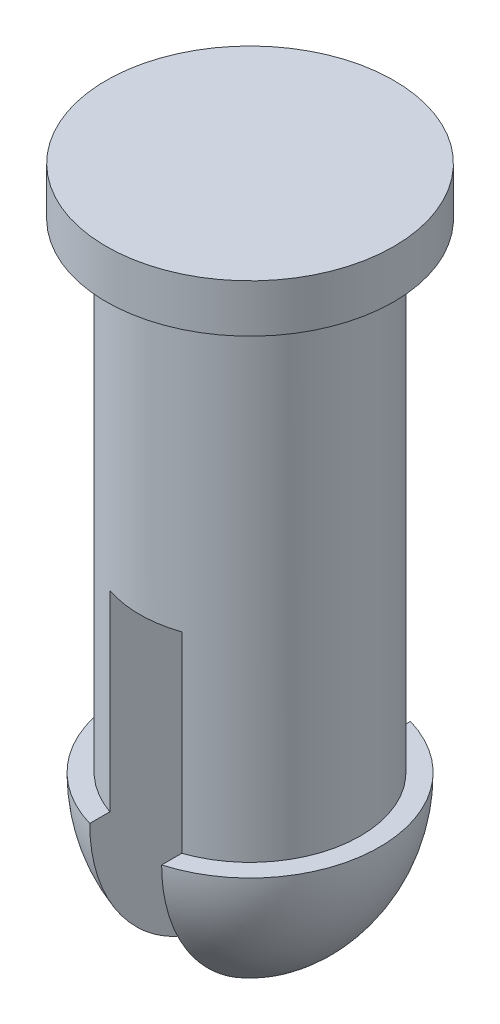
ISO-10303-21;
HEADER;
FILE_DESCRIPTION(('STEP AP214'),'2;1');
FILE_NAME('part.step','',(''),(''),'','','');
FILE_SCHEMA(('AUTOMOTIVE_DESIGN { 1 0 10303 214 1 1 1 1 }'));
ENDSEC;
DATA;
#1=APPLICATION_CONTEXT('core data for automotive mechanical design processes');
#2=APPLICATION_PROTOCOL_DEFINITION('international standard','automotive_design',2000,#1);
#3=PRODUCT_CONTEXT('',#1,'mechanical');
#4=PRODUCT('Part','Part','',(#3));
#5=PRODUCT_RELATED_PRODUCT_CATEGORY('part','',(#4));
#6=PRODUCT_DEFINITION_FORMATION('','',#4);
#7=PRODUCT_DEFINITION_CONTEXT('part definition',#1,'design');
#8=PRODUCT_DEFINITION('design','',#6,#7);
#9=PRODUCT_DEFINITION_SHAPE('','',#8);
#10=(LENGTH_UNIT() NAMED_UNIT(*) SI_UNIT(.MILLI.,.METRE.));
#11=(NAMED_UNIT(*) PLANE_ANGLE_UNIT() SI_UNIT($,.RADIAN.));
#12=(NAMED_UNIT(*) SI_UNIT($,.STERADIAN.) SOLID_ANGLE_UNIT());
#13=UNCERTAINTY_MEASURE_WITH_UNIT(LENGTH_MEASURE(1.E-05),#10,'distance_accuracy_value','');
#14=(GEOMETRIC_REPRESENTATION_CONTEXT(3) GLOBAL_UNCERTAINTY_ASSIGNED_CONTEXT((#13)) GLOBAL_UNIT_ASSIGNED_CONTEXT((#10,
#11,#12)) REPRESENTATION_CONTEXT('',''));
#15=CARTESIAN_POINT('',(0.,0.,0.));
#16=DIRECTION('',(0.,0.,1.));
#17=DIRECTION('',(1.,0.,0.));
#18=AXIS2_PLACEMENT_3D('',#15,#16,#17);
#19=CARTESIAN_POINT('',(0.,0.254,0.));
#20=DIRECTION('',(0.,-1.,0.));
#21=DIRECTION('',(1.,0.,0.));
#22=AXIS2_PLACEMENT_3D('',#19,#20,#21);
#23=DEGENERATE_TOROIDAL_SURFACE('',#22,0.100424074074073,0.443324074074074,.F.);
#24=CARTESIAN_POINT('',(-0.09525,-0.14380383531194,0.));
#25=CARTESIAN_POINT('',(-0.09525,-0.143798708598324,-0.0116978865939817));
#26=CARTESIAN_POINT('',(-0.09525,-0.142715538211138,-0.0234088814016298));
#27=CARTESIAN_POINT('',(-0.09525,-0.138657207219164,-0.0465179519451306));
#28=CARTESIAN_POINT('',(-0.09525,-0.135673977682257,-0.0579144758231862));
#29=CARTESIAN_POINT('',(-0.09525,-0.12632829282076,-0.0861002756112994));
#30=CARTESIAN_POINT('',(-0.09525,-0.11901364004664,-0.102569887425098));
#31=CARTESIAN_POINT('',(-0.09525,-0.101956977386856,-0.134180103254347));
#32=CARTESIAN_POINT('',(-0.09525,-0.0922120534239419,-0.149319082052771));
#33=CARTESIAN_POINT('',(-0.09525,-0.0702582579208381,-0.178715200741944));
#34=CARTESIAN_POINT('',(-0.09525,-0.057961798385589,-0.192906889548112));
#35=CARTESIAN_POINT('',(-0.09525,-0.0315463794091867,-0.21944697342977));
#36=CARTESIAN_POINT('',(-0.09525,-0.0174286233447382,-0.23179657410469));
#37=CARTESIAN_POINT('',(-0.09525,0.015476755915726,-0.256870258977447));
#38=CARTESIAN_POINT('',(-0.09525,0.0346223542071199,-0.269127970422762));
#39=CARTESIAN_POINT('',(-0.09525,0.0746448702039047,-0.290416918236679));
#40=CARTESIAN_POINT('',(-0.09525,0.0955233241799726,-0.299445253117677));
#41=CARTESIAN_POINT('',(-0.09525,0.139377798701819,-0.314366568068082));
#42=CARTESIAN_POINT('',(-0.09525,0.162405368767697,-0.320108567852826));
#43=CARTESIAN_POINT('',(-0.09525,0.209090106346814,-0.327690915938621));
#44=CARTESIAN_POINT('',(-0.09525,0.232747219687902,-0.329531598855477));
#45=CARTESIAN_POINT('',(-0.09525,0.280306903484965,-0.329264033719875));
#46=CARTESIAN_POINT('',(-0.09525,0.304209238168853,-0.327111084682118));
#47=CARTESIAN_POINT('',(-0.09525,0.351315212960913,-0.318824283635956));
#48=CARTESIAN_POINT('',(-0.09525,0.374518812965187,-0.312690203584374));
#49=CARTESIAN_POINT('',(-0.09525,0.419565307751267,-0.296601548392065));
#50=CARTESIAN_POINT('',(-0.09525,0.441408042354345,-0.286646524496316));
#51=CARTESIAN_POINT('',(-0.09525,0.483094582715537,-0.263171080041853));
#52=CARTESIAN_POINT('',(-0.09525,0.502938092242373,-0.249650132179939));
#53=CARTESIAN_POINT('',(-0.09525,0.53980057194147,-0.219551779175753));
#54=CARTESIAN_POINT('',(-0.09525,0.556847253785236,-0.203008293323007));
#55=CARTESIAN_POINT('',(-0.09525,0.587764056498323,-0.167146891067861));
#56=CARTESIAN_POINT('',(-0.09525,0.60163515097761,-0.147829827985736));
#57=CARTESIAN_POINT('',(-0.09525,0.620704370609078,-0.114835283701304));
#58=CARTESIAN_POINT('',(-0.09525,0.627177472814807,-0.101886285048612));
#59=CARTESIAN_POINT('',(-0.09525,0.63823032104283,-0.0752144754912631));
#60=CARTESIAN_POINT('',(-0.09525,0.642815278975796,-0.0614939151343913));
#61=CARTESIAN_POINT('',(-0.09525,0.648759274674796,-0.0361940286838822));
#62=CARTESIAN_POINT('',(-0.09525,0.650576517058823,-0.0247268282736564));
#63=CARTESIAN_POINT('',(-0.09525,0.652133783254577,-0.00166234313923318));
#64=CARTESIAN_POINT('',(-0.09525,0.651877892164309,0.00993464081327145));
#65=CARTESIAN_POINT('',(-0.09525,0.649378700028875,0.0328429115374028));
#66=CARTESIAN_POINT('',(-0.09525,0.647144335046938,0.0441552479711653));
#67=CARTESIAN_POINT('',(-0.09525,0.641127144538548,0.0663826071048562));
#68=CARTESIAN_POINT('',(-0.09525,0.637338731193054,0.0772960396366597));
#69=CARTESIAN_POINT('',(-0.09525,0.625525330737952,0.105986515104124));
#70=CARTESIAN_POINT('',(-0.09525,0.616380801067651,0.123303318103477));
#71=CARTESIAN_POINT('',(-0.09525,0.595505520051646,0.156271040357609));
#72=CARTESIAN_POINT('',(-0.09525,0.583773102885923,0.171920876922021));
#73=CARTESIAN_POINT('',(-0.09525,0.557768760477826,0.201774418592652));
#74=CARTESIAN_POINT('',(-0.09525,0.543431995199821,0.215921670632783));
#75=CARTESIAN_POINT('',(-0.09525,0.512863814559463,0.241973854693591));
#76=CARTESIAN_POINT('',(-0.09525,0.496632872797671,0.253879345284096));
#77=CARTESIAN_POINT('',(-0.09525,0.46009498350072,0.276838628633972));
#78=CARTESIAN_POINT('',(-0.09525,0.439540983434918,0.287501614793902));
#79=CARTESIAN_POINT('',(-0.09525,0.396964577453154,0.305341650380823));
#80=CARTESIAN_POINT('',(-0.09525,0.374941389024291,0.312516825011983));
#81=CARTESIAN_POINT('',(-0.09525,0.329361619975479,0.323357104557578));
#82=CARTESIAN_POINT('',(-0.09525,0.305779014485842,0.326913153314081));
#83=CARTESIAN_POINT('',(-0.09525,0.258350620993315,0.330045936990706));
#84=CARTESIAN_POINT('',(-0.09525,0.234504815432745,0.329622404816861));
#85=CARTESIAN_POINT('',(-0.09525,0.187044495039853,0.324789330992645));
#86=CARTESIAN_POINT('',(-0.09525,0.163432917398416,0.320350865209196));
#87=CARTESIAN_POINT('',(-0.09525,0.117299024014177,0.307565996622778));
#88=CARTESIAN_POINT('',(-0.09525,0.0947763977189524,0.299220715323889));
#89=CARTESIAN_POINT('',(-0.09525,0.0515220300310496,0.278868270454153));
#90=CARTESIAN_POINT('',(-0.09525,0.0307857910164995,0.266870669966883));
#91=CARTESIAN_POINT('',(-0.09525,-0.00836210083103733,0.239495531622993));
#92=CARTESIAN_POINT('',(-0.09525,-0.0267713123633263,0.224114489762165));
#93=CARTESIAN_POINT('',(-0.09525,-0.0603344558824616,0.190643215186327));
#94=CARTESIAN_POINT('',(-0.09525,-0.0755365792341319,0.172601254813188));
#95=CARTESIAN_POINT('',(-0.09525,-0.102393694991928,0.134012956565368));
#96=CARTESIAN_POINT('',(-0.09525,-0.114053440093834,0.113470026492505));
#97=CARTESIAN_POINT('',(-0.09525,-0.128492885752878,0.0797585630506732));
#98=CARTESIAN_POINT('',(-0.09525,-0.132926025386191,0.0672944308752063));
#99=CARTESIAN_POINT('',(-0.09525,-0.13972331098491,0.0418403142864246));
#100=CARTESIAN_POINT('',(-0.09525,-0.142098727806521,0.0288536074685724));
#101=CARTESIAN_POINT('',(-0.09525,-0.143590110948546,0.0105262853654323));
#102=CARTESIAN_POINT('',(-0.09525,-0.143806142517634,0.00526447010171672));
#103=CARTESIAN_POINT('',(-0.09525,-0.14380383531194,0.));
#104=B_SPLINE_CURVE_WITH_KNOTS('',3,(#24,#25,#26,#27,#28,#29,#30,#31,#32,#33,#34,#35,#36,#37,
#38,#39,#40,#41,#42,#43,#44,#45,#46,#47,#48,#49,#50,#51,#52,#53,#54,#55,#56,#57,#58,#59,#60,#61,
#62,#63,#64,#65,#66,#67,#68,#69,#70,#71,#72,#73,#74,#75,#76,#77,#78,#79,#80,#81,#82,#83,#84,#85,
#86,#87,#88,#89,#90,#91,#92,#93,#94,#95,#96,#97,#98,#99,#100,#101,#102,#103),.UNSPECIFIED.,.T.,
.F.,(4,2,2,2,2,2,2,2,2,2,2,2,2,2,2,2,2,2,2,2,2,2,2,2,2,2,2,2,2,2,2,2,2,2,2,2,2,2,2,4),(0.,
0.0350771900369046,0.0703043438095146,0.124077559639555,0.177915566236281,0.234057250899011,
0.290162029512963,0.358053437946411,0.426005692239297,0.49687062542198,0.567729480275961,
0.639386252836186,0.711047130330509,0.782716426693327,0.854396326944428,0.925316385332746,
0.996214670985821,1.03953954585877,1.08274401473299,1.11741781755031,1.15202331247434,
1.18647329943672,1.22104825777108,1.27948097447399,1.33795141458389,1.39815099764076,
1.45833556112645,1.52748201207388,1.59666559017611,1.66787715004796,1.7390934893964,
1.81082700301668,1.88253993717953,1.95406669301936,2.02566787604014,2.09610138125841,
2.16643996647697,2.20601435037277,2.2453705757496,2.26115657407655),.UNSPECIFIED.);
#105=CARTESIAN_POINT('',(-0.09525,0.253999999999976,0.329405293673312));
#106=VERTEX_POINT('',#105);
#107=CARTESIAN_POINT('',(-0.09525,0.253999999999976,-0.329405293673312));
#108=VERTEX_POINT('',#107);
#109=EDGE_CURVE('E153',#106,#108,#104,.T.);
#110=ORIENTED_EDGE('',*,*,#109,.F.);
#111=CARTESIAN_POINT('',(0.,0.253999999999976,0.));
#112=DIRECTION('',(0.,-1.,0.));
#113=DIRECTION('',(1.,0.,0.));
#114=AXIS2_PLACEMENT_3D('',#111,#112,#113);
#115=CIRCLE('',#114,0.342900000000001);
#116=EDGE_CURVE('E155',#106,#108,#115,.T.);
#117=ORIENTED_EDGE('',*,*,#116,.T.);
#118=EDGE_LOOP('',(#110,#117));
#119=FACE_BOUND('',#118,.T.);
#120=ADVANCED_FACE('F36',(#119),#23,.F.);
#121=CARTESIAN_POINT('',(0.2921,0.254,0.));
#122=DIRECTION('',(0.,1.,0.));
#123=DIRECTION('',(-1.,0.,0.));
#124=AXIS2_PLACEMENT_3D('',#121,#122,#123);
#125=PLANE('',#124);
#126=DIRECTION('',(0.,0.,1.));
#127=VECTOR('',#126,1.);
#128=CARTESIAN_POINT('',(-0.09525,0.253999999999998,0.));
#129=LINE('',#128,#127);
#130=CARTESIAN_POINT('',(-0.09525,0.253999999999976,-0.276133749295519));
#131=VERTEX_POINT('',#130);
#132=EDGE_CURVE('E60',#108,#131,#129,.T.);
#133=ORIENTED_EDGE('',*,*,#132,.F.);
#134=ORIENTED_EDGE('',*,*,#116,.F.);
#135=CARTESIAN_POINT('',(-0.09525,0.253999999999976,0.276133749295519));
#136=VERTEX_POINT('',#135);
#137=EDGE_CURVE('E161',#136,#106,#129,.T.);
#138=ORIENTED_EDGE('',*,*,#137,.F.);
#139=CARTESIAN_POINT('',(0.,0.253999999999976,0.));
#140=DIRECTION('',(0.,-1.,0.));
#141=DIRECTION('',(1.,0.,0.));
#142=AXIS2_PLACEMENT_3D('',#139,#140,#141);
#143=CIRCLE('',#142,0.292100000000001);
#144=EDGE_CURVE('E165',#136,#131,#143,.T.);
#145=ORIENTED_EDGE('',*,*,#144,.T.);
#146=EDGE_LOOP('',(#133,#134,#138,#145));
#147=FACE_BOUND('',#146,.T.);
#148=ADVANCED_FACE('F127',(#147),#125,.T.);
#149=CARTESIAN_POINT('',(0.09525,-0.14380383531194,0.));
#150=CARTESIAN_POINT('',(0.09525,-0.143798708598324,0.0116978865939816));
#151=CARTESIAN_POINT('',(0.09525,-0.142715538211138,0.0234088814016297));
#152=CARTESIAN_POINT('',(0.09525,-0.138657207219164,0.0465179519451303));
#153=CARTESIAN_POINT('',(0.09525,-0.135673977682256,0.0579144758231858));
#154=CARTESIAN_POINT('',(0.09525,-0.12632829282076,0.0861002756112989));
#155=CARTESIAN_POINT('',(0.09525,-0.11901364004664,0.102569887425098));
#156=CARTESIAN_POINT('',(0.09525,-0.101956977386856,0.134180103254346));
#157=CARTESIAN_POINT('',(0.09525,-0.0922120534239419,0.149319082052771));
#158=CARTESIAN_POINT('',(0.09525,-0.0702582579208381,0.178715200741943));
#159=CARTESIAN_POINT('',(0.09525,-0.057961798385589,0.192906889548112));
#160=CARTESIAN_POINT('',(0.09525,-0.0315463794091867,0.21944697342977));
#161=CARTESIAN_POINT('',(0.09525,-0.0174286233447383,0.231796574104689));
#162=CARTESIAN_POINT('',(0.09525,0.015476755915726,0.256870258977447));
#163=CARTESIAN_POINT('',(0.09525,0.0346223542071198,0.269127970422761));
#164=CARTESIAN_POINT('',(0.09525,0.0746448702039045,0.290416918236678));
#165=CARTESIAN_POINT('',(0.0952499999999999,0.0955233241799724,0.299445253117676));
#166=CARTESIAN_POINT('',(0.0952499999999999,0.139377798701818,0.314366568068081));
#167=CARTESIAN_POINT('',(0.0952499999999999,0.162405368767696,0.320108567852825));
#168=CARTESIAN_POINT('',(0.0952499999999999,0.209090106346813,0.327690915938621));
#169=CARTESIAN_POINT('',(0.0952499999999999,0.232747219687902,0.329531598855476));
#170=CARTESIAN_POINT('',(0.0952499999999999,0.280306903484964,0.329264033719875));
#171=CARTESIAN_POINT('',(0.0952499999999999,0.304209238168852,0.327111084682118));
#172=CARTESIAN_POINT('',(0.0952499999999999,0.351315212960913,0.318824283635955));
#173=CARTESIAN_POINT('',(0.0952499999999999,0.374518812965187,0.312690203584374));
#174=CARTESIAN_POINT('',(0.0952499999999998,0.419565307751267,0.296601548392065));
#175=CARTESIAN_POINT('',(0.0952499999999998,0.441408042354344,0.286646524496315));
#176=CARTESIAN_POINT('',(0.0952499999999998,0.483094582715537,0.263171080041853));
#177=CARTESIAN_POINT('',(0.0952499999999998,0.502938092242372,0.249650132179939));
#178=CARTESIAN_POINT('',(0.0952499999999998,0.539800571941469,0.219551779175752));
#179=CARTESIAN_POINT('',(0.0952499999999998,0.556847253785235,0.203008293323007));
#180=CARTESIAN_POINT('',(0.0952499999999998,0.587764056498322,0.167146891067861));
#181=CARTESIAN_POINT('',(0.0952499999999998,0.601635150977609,0.147829827985736));
#182=CARTESIAN_POINT('',(0.0952499999999998,0.620704370609077,0.114835283701304));
#183=CARTESIAN_POINT('',(0.0952499999999998,0.627177472814806,0.101886285048612));
#184=CARTESIAN_POINT('',(0.0952499999999998,0.638230321042829,0.0752144754912629));
#185=CARTESIAN_POINT('',(0.0952499999999998,0.642815278975795,0.0614939151343909));
#186=CARTESIAN_POINT('',(0.0952499999999998,0.648759274674795,0.0361940286838815));
#187=CARTESIAN_POINT('',(0.0952499999999998,0.650576517058822,0.0247268282736555));
#188=CARTESIAN_POINT('',(0.0952499999999998,0.652133783254575,0.0016623431392319));
#189=CARTESIAN_POINT('',(0.0952499999999998,0.651877892164307,-0.00993464081327287));
#190=CARTESIAN_POINT('',(0.0952499999999998,0.649378700028873,-0.0328429115374046));
#191=CARTESIAN_POINT('',(0.0952499999999998,0.647144335046936,-0.0441552479711672));
#192=CARTESIAN_POINT('',(0.0952499999999998,0.641127144538546,-0.0663826071048584));
#193=CARTESIAN_POINT('',(0.0952499999999998,0.637338731193052,-0.077296039636662));
#194=CARTESIAN_POINT('',(0.0952499999999998,0.62552533073795,-0.105986515104127));
#195=CARTESIAN_POINT('',(0.0952499999999998,0.616380801067649,-0.12330331810348));
#196=CARTESIAN_POINT('',(0.0952499999999998,0.595505520051644,-0.156271040357612));
#197=CARTESIAN_POINT('',(0.0952499999999998,0.58377310288592,-0.171920876922023));
#198=CARTESIAN_POINT('',(0.0952499999999998,0.557768760477823,-0.201774418592654));
#199=CARTESIAN_POINT('',(0.0952499999999998,0.543431995199818,-0.215921670632785));
#200=CARTESIAN_POINT('',(0.0952499999999998,0.512863814559459,-0.241973854693592));
#201=CARTESIAN_POINT('',(0.0952499999999998,0.496632872797668,-0.253879345284097));
#202=CARTESIAN_POINT('',(0.0952499999999998,0.460094983500717,-0.276838628633973));
#203=CARTESIAN_POINT('',(0.0952499999999999,0.439540983434915,-0.287501614793903));
#204=CARTESIAN_POINT('',(0.0952499999999999,0.396964577453151,-0.305341650380823));
#205=CARTESIAN_POINT('',(0.0952499999999999,0.374941389024288,-0.312516825011983));
#206=CARTESIAN_POINT('',(0.0952499999999999,0.329361619975476,-0.323357104557578));
#207=CARTESIAN_POINT('',(0.0952499999999999,0.305779014485839,-0.326913153314081));
#208=CARTESIAN_POINT('',(0.0952499999999999,0.258350620993312,-0.330045936990706));
#209=CARTESIAN_POINT('',(0.0952499999999999,0.234504815432742,-0.32962240481686));
#210=CARTESIAN_POINT('',(0.0952499999999999,0.18704449503985,-0.324789330992645));
#211=CARTESIAN_POINT('',(0.0952499999999999,0.163432917398414,-0.320350865209195));
#212=CARTESIAN_POINT('',(0.09525,0.117299024014174,-0.307565996622777));
#213=CARTESIAN_POINT('',(0.09525,0.09477639771895,-0.299220715323888));
#214=CARTESIAN_POINT('',(0.09525,0.0515220300310475,-0.278868270454151));
#215=CARTESIAN_POINT('',(0.09525,0.0307857910164975,-0.266870669966881));
#216=CARTESIAN_POINT('',(0.09525,-0.00836210083103915,-0.239495531622991));
#217=CARTESIAN_POINT('',(0.09525,-0.0267713123633281,-0.224114489762163));
#218=CARTESIAN_POINT('',(0.09525,-0.0603344558824631,-0.190643215186325));
#219=CARTESIAN_POINT('',(0.09525,-0.0755365792341332,-0.172601254813185));
#220=CARTESIAN_POINT('',(0.09525,-0.10239369499193,-0.134012956565366));
#221=CARTESIAN_POINT('',(0.09525,-0.114053440093835,-0.113470026492503));
#222=CARTESIAN_POINT('',(0.09525,-0.128492885752879,-0.0797585630506708));
#223=CARTESIAN_POINT('',(0.09525,-0.132926025386191,-0.067294430875204));
#224=CARTESIAN_POINT('',(0.09525,-0.139723310984911,-0.0418403142864225));
#225=CARTESIAN_POINT('',(0.09525,-0.142098727806521,-0.0288536074685705));
#226=CARTESIAN_POINT('',(0.09525,-0.143590110948546,-0.0105262853654311));
#227=CARTESIAN_POINT('',(0.09525,-0.143806142517634,-0.00526447010171612));
#228=CARTESIAN_POINT('',(0.09525,-0.14380383531194,0.));
#229=B_SPLINE_CURVE_WITH_KNOTS('',3,(#149,#150,#151,#152,#153,#154,#155,#156,#157,#158,#159,
#160,#161,#162,#163,#164,#165,#166,#167,#168,#169,#170,#171,#172,#173,#174,#175,#176,#177,#178,
#179,#180,#181,#182,#183,#184,#185,#186,#187,#188,#189,#190,#191,#192,#193,#194,#195,#196,#197,
#198,#199,#200,#201,#202,#203,#204,#205,#206,#207,#208,#209,#210,#211,#212,#213,#214,#215,#216,
#217,#218,#219,#220,#221,#222,#223,#224,#225,#226,#227,#228),.UNSPECIFIED.,.T.,.F.,(4,2,2,2,2,2,
2,2,2,2,2,2,2,2,2,2,2,2,2,2,2,2,2,2,2,2,2,2,2,2,2,2,2,2,2,2,2,2,2,4),(0.,0.0350771900369044,
0.0703043438095141,0.124077559639555,0.177915566236281,0.23405725089901,0.290162029512963,
0.35805343794641,0.426005692239296,0.496870625421979,0.56772948027596,0.639386252836185,
0.711047130330507,0.782716426693326,0.854396326944426,0.925316385332745,0.996214670985819,
1.03953954585877,1.08274401473299,1.11741781755031,1.15202331247434,1.18647329943672,
1.22104825777108,1.27948097447399,1.33795141458389,1.39815099764076,1.45833556112645,
1.52748201207388,1.59666559017611,1.66787715004796,1.7390934893964,1.81082700301668,
1.88253993717953,1.95406669301936,2.02566787604014,2.0961013812584,2.16643996647696,
2.20601435037277,2.24537057574959,2.26115657407655),.UNSPECIFIED.);
#230=CARTESIAN_POINT('',(0.0952499999999999,0.253999999999977,-0.329405293673312));
#231=VERTEX_POINT('',#230);
#232=CARTESIAN_POINT('',(0.0952499999999999,0.253999999999977,0.329405293673312));
#233=VERTEX_POINT('',#232);
#234=EDGE_CURVE('E107',#231,#233,#229,.T.);
#235=ORIENTED_EDGE('',*,*,#234,.F.);
#236=EDGE_CURVE('E163',#231,#233,#115,.T.);
#237=ORIENTED_EDGE('',*,*,#236,.T.);
#238=EDGE_LOOP('',(#235,#237));
#239=FACE_BOUND('',#238,.T.);
#240=ADVANCED_FACE('F38',(#239),#23,.F.);
#241=CARTESIAN_POINT('',(0.,1.651,0.));
#242=DIRECTION('',(0.,1.,0.));
#243=DIRECTION('',(-1.,0.,0.));
#244=AXIS2_PLACEMENT_3D('',#241,#242,#243);
#245=PLANE('',#244);
#246=CARTESIAN_POINT('',(0.,1.65100000000007,0.));
#247=DIRECTION('',(0.,-1.,0.));
#248=DIRECTION('',(1.,0.,0.));
#249=AXIS2_PLACEMENT_3D('',#246,#247,#248);
#250=CIRCLE('',#249,0.381000000000006);
#251=CARTESIAN_POINT('',(0.381,1.65100000000007,0.));
#252=VERTEX_POINT('',#251);
#253=EDGE_CURVE('E176',#252,#252,#250,.T.);
#254=ORIENTED_EDGE('',*,*,#253,.F.);
#255=EDGE_LOOP('',(#254));
#256=FACE_BOUND('',#255,.T.);
#257=ADVANCED_FACE('F136',(#256),#245,.T.);
#258=CARTESIAN_POINT('',(3.43024899888577E-12,-1000.,0.));
#259=DIRECTION('',(0.,-1.,0.));
#260=DIRECTION('',(1.,0.,0.));
#261=AXIS2_PLACEMENT_3D('',#258,#259,#260);
#262=CYLINDRICAL_SURFACE('',#261,0.381000000000005);
#263=ORIENTED_EDGE('',*,*,#253,.T.);
#264=EDGE_LOOP('',(#263));
#265=FACE_BOUND('',#264,.T.);
#266=CARTESIAN_POINT('',(0.,1.52400000000008,0.));
#267=DIRECTION('',(0.,-1.,0.));
#268=DIRECTION('',(1.,0.,0.));
#269=AXIS2_PLACEMENT_3D('',#266,#267,#268);
#270=CIRCLE('',#269,0.381000000000005);
#271=CARTESIAN_POINT('',(0.381,1.52400000000008,0.));
#272=VERTEX_POINT('',#271);
#273=EDGE_CURVE('E173',#272,#272,#270,.T.);
#274=ORIENTED_EDGE('',*,*,#273,.F.);
#275=EDGE_LOOP('',(#274));
#276=FACE_BOUND('',#275,.T.);
#277=ADVANCED_FACE('F133',(#265,#276),#262,.T.);
#278=CARTESIAN_POINT('',(0.381,1.524,0.));
#279=DIRECTION('',(0.,-1.,0.));
#280=DIRECTION('',(1.,0.,0.));
#281=AXIS2_PLACEMENT_3D('',#278,#279,#280);
#282=PLANE('',#281);
#283=ORIENTED_EDGE('',*,*,#273,.T.);
#284=EDGE_LOOP('',(#283));
#285=FACE_BOUND('',#284,.T.);
#286=CARTESIAN_POINT('',(0.,1.52400000000008,0.));
#287=DIRECTION('',(0.,-1.,0.));
#288=DIRECTION('',(1.,0.,0.));
#289=AXIS2_PLACEMENT_3D('',#286,#287,#288);
#290=CIRCLE('',#289,0.292100000000005);
#291=CARTESIAN_POINT('',(0.2921,1.52400000000008,0.));
#292=VERTEX_POINT('',#291);
#293=EDGE_CURVE('E170',#292,#292,#290,.T.);
#294=ORIENTED_EDGE('',*,*,#293,.F.);
#295=EDGE_LOOP('',(#294));
#296=FACE_BOUND('',#295,.T.);
#297=ADVANCED_FACE('F130',(#285,#296),#282,.T.);
#298=CARTESIAN_POINT('',(3.43024899888577E-12,-1000.,0.));
#299=DIRECTION('',(0.,-1.,0.));
#300=DIRECTION('',(1.,0.,0.));
#301=AXIS2_PLACEMENT_3D('',#298,#299,#300);
#302=CYLINDRICAL_SURFACE('',#301,0.292100000000003);
#303=DIRECTION('',(0.,-1.,0.));
#304=VECTOR('',#303,1.);
#305=CARTESIAN_POINT('',(-0.09525,-1000.,0.276133749294338));
#306=LINE('',#305,#304);
#307=CARTESIAN_POINT('',(-0.09525,0.761999999999929,0.276133749295522));
#308=VERTEX_POINT('',#307);
#309=EDGE_CURVE('E157',#308,#136,#306,.T.);
#310=ORIENTED_EDGE('',*,*,#309,.F.);
#311=CARTESIAN_POINT('',(0.,0.761999999999929,0.));
#312=DIRECTION('',(0.,1.,0.));
#313=DIRECTION('',(0.,0.,1.));
#314=AXIS2_PLACEMENT_3D('',#311,#312,#313);
#315=CIRCLE('',#314,0.292100000000003);
#316=CARTESIAN_POINT('',(0.0952499999999998,0.761999999999978,0.27613374929661));
#317=VERTEX_POINT('',#316);
#318=EDGE_CURVE('E11',#317,#308,#315,.F.);
#319=ORIENTED_EDGE('',*,*,#318,.F.);
#320=DIRECTION('',(0.,-1.,0.));
#321=VECTOR('',#320,1.);
#322=CARTESIAN_POINT('',(0.095250000000273,-1000.,0.27613374929661));
#323=LINE('',#322,#321);
#324=CARTESIAN_POINT('',(0.0952499999999999,0.253999999999977,0.276133749295519));
#325=VERTEX_POINT('',#324);
#326=EDGE_CURVE('E99',#325,#317,#323,.F.);
#327=ORIENTED_EDGE('',*,*,#326,.F.);
#328=CARTESIAN_POINT('',(0.0952499999999999,0.253999999999977,-0.276133749295519));
#329=VERTEX_POINT('',#328);
#330=EDGE_CURVE('E106',#329,#325,#143,.T.);
#331=ORIENTED_EDGE('',*,*,#330,.F.);
#332=DIRECTION('',(0.,-1.,0.));
#333=VECTOR('',#332,1.);
#334=CARTESIAN_POINT('',(0.095250000000273,-1000.,-0.27613374929661));
#335=LINE('',#334,#333);
#336=CARTESIAN_POINT('',(0.0952499999999998,0.761999999999978,-0.27613374929661));
#337=VERTEX_POINT('',#336);
#338=EDGE_CURVE('E52',#337,#329,#335,.T.);
#339=ORIENTED_EDGE('',*,*,#338,.F.);
#340=CARTESIAN_POINT('',(-0.09525,0.761999999999929,-0.276133749295522));
#341=VERTEX_POINT('',#340);
#342=EDGE_CURVE('E41',#341,#337,#315,.F.);
#343=ORIENTED_EDGE('',*,*,#342,.F.);
#344=DIRECTION('',(0.,-1.,0.));
#345=VECTOR('',#344,1.);
#346=CARTESIAN_POINT('',(-0.09525,-1000.,-0.276133749294338));
#347=LINE('',#346,#345);
#348=EDGE_CURVE('E156',#131,#341,#347,.F.);
#349=ORIENTED_EDGE('',*,*,#348,.F.);
#350=ORIENTED_EDGE('',*,*,#144,.F.);
#351=EDGE_LOOP('',(#310,#319,#327,#331,#339,#343,#349,#350));
#352=FACE_BOUND('',#351,.T.);
#353=ORIENTED_EDGE('',*,*,#293,.T.);
#354=EDGE_LOOP('',(#353));
#355=FACE_BOUND('',#354,.T.);
#356=ADVANCED_FACE('F103',(#352,#355),#302,.T.);
#357=DIRECTION('',(0.,0.,-1.));
#358=VECTOR('',#357,1.);
#359=CARTESIAN_POINT('',(0.0952499999999999,0.253999999999999,0.));
#360=LINE('',#359,#358);
#361=EDGE_CURVE('E180',#233,#325,#360,.T.);
#362=ORIENTED_EDGE('',*,*,#361,.F.);
#363=ORIENTED_EDGE('',*,*,#236,.F.);
#364=EDGE_CURVE('E179',#329,#231,#360,.T.);
#365=ORIENTED_EDGE('',*,*,#364,.F.);
#366=ORIENTED_EDGE('',*,*,#330,.T.);
#367=EDGE_LOOP('',(#362,#363,#365,#366));
#368=FACE_BOUND('',#367,.T.);
#369=ADVANCED_FACE('F122',(#368),#125,.T.);
#370=CARTESIAN_POINT('',(-0.09525,0.253999999999978,-1.27));
#371=DIRECTION('',(-1.,0.,0.));
#372=DIRECTION('',(0.,0.,1.));
#373=AXIS2_PLACEMENT_3D('',#370,#371,#372);
#374=PLANE('',#373);
#375=ORIENTED_EDGE('',*,*,#348,.T.);
#376=DIRECTION('',(0.,0.,1.));
#377=VECTOR('',#376,1.);
#378=CARTESIAN_POINT('',(-0.09525,0.761999999999978,-1.27));
#379=LINE('',#378,#377);
#380=EDGE_CURVE('E95',#341,#308,#379,.T.);
#381=ORIENTED_EDGE('',*,*,#380,.T.);
#382=ORIENTED_EDGE('',*,*,#309,.T.);
#383=ORIENTED_EDGE('',*,*,#137,.T.);
#384=ORIENTED_EDGE('',*,*,#109,.T.);
#385=ORIENTED_EDGE('',*,*,#132,.T.);
#386=EDGE_LOOP('',(#375,#381,#382,#383,#384,#385));
#387=FACE_BOUND('',#386,.T.);
#388=ADVANCED_FACE('F125',(#387),#374,.F.);
#389=CARTESIAN_POINT('',(-0.09525,0.761999999999978,-1.27));
#390=DIRECTION('',(0.,1.,0.));
#391=DIRECTION('',(0.,0.,1.));
#392=AXIS2_PLACEMENT_3D('',#389,#390,#391);
#393=PLANE('',#392);
#394=ORIENTED_EDGE('',*,*,#342,.T.);
#395=DIRECTION('',(0.,0.,1.));
#396=VECTOR('',#395,1.);
#397=CARTESIAN_POINT('',(0.0952499999999998,0.761999999999978,-1.27));
#398=LINE('',#397,#396);
#399=EDGE_CURVE('E92',#337,#317,#398,.T.);
#400=ORIENTED_EDGE('',*,*,#399,.T.);
#401=ORIENTED_EDGE('',*,*,#318,.T.);
#402=ORIENTED_EDGE('',*,*,#380,.F.);
#403=EDGE_LOOP('',(#394,#400,#401,#402));
#404=FACE_BOUND('',#403,.T.);
#405=ADVANCED_FACE('F91',(#404),#393,.F.);
#406=CARTESIAN_POINT('',(0.0952499999999998,0.761999999999978,-1.27));
#407=DIRECTION('',(1.,0.,0.));
#408=DIRECTION('',(0.,1.,0.));
#409=AXIS2_PLACEMENT_3D('',#406,#407,#408);
#410=PLANE('',#409);
#411=ORIENTED_EDGE('',*,*,#326,.T.);
#412=ORIENTED_EDGE('',*,*,#399,.F.);
#413=ORIENTED_EDGE('',*,*,#338,.T.);
#414=ORIENTED_EDGE('',*,*,#364,.T.);
#415=ORIENTED_EDGE('',*,*,#234,.T.);
#416=ORIENTED_EDGE('',*,*,#361,.T.);
#417=EDGE_LOOP('',(#411,#412,#413,#414,#415,#416));
#418=FACE_BOUND('',#417,.T.);
#419=ADVANCED_FACE('F97',(#418),#410,.F.);
#420=CLOSED_SHELL('',(#120,#148,#240,#257,#277,#297,#356,#369,#388,#405,#419));
#421=MANIFOLD_SOLID_BREP('B2',#420);
#422=ADVANCED_BREP_SHAPE_REPRESENTATION('',(#18,#421),#14);
#423=SHAPE_DEFINITION_REPRESENTATION(#9,#422);
ENDSEC;
END-ISO-10303-21;
